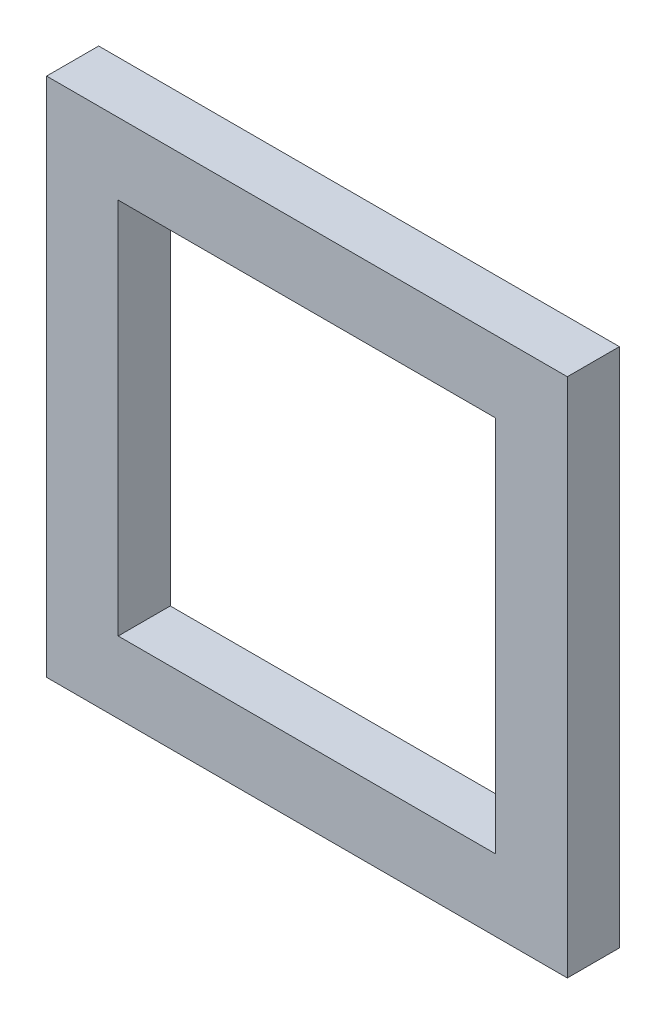
ISO-10303-21;
HEADER;
FILE_DESCRIPTION(('STEP AP214'),'2;1');
FILE_NAME('part.step','',(''),(''),'','','');
FILE_SCHEMA(('AUTOMOTIVE_DESIGN { 1 0 10303 214 1 1 1 1 }'));
ENDSEC;
DATA;
#1=APPLICATION_CONTEXT('core data for automotive mechanical design processes');
#2=APPLICATION_PROTOCOL_DEFINITION('international standard','automotive_design',2000,#1);
#3=PRODUCT_CONTEXT('',#1,'mechanical');
#4=PRODUCT('Part','Part','',(#3));
#5=PRODUCT_RELATED_PRODUCT_CATEGORY('part','',(#4));
#6=PRODUCT_DEFINITION_FORMATION('','',#4);
#7=PRODUCT_DEFINITION_CONTEXT('part definition',#1,'design');
#8=PRODUCT_DEFINITION('design','',#6,#7);
#9=PRODUCT_DEFINITION_SHAPE('','',#8);
#10=(LENGTH_UNIT() NAMED_UNIT(*) SI_UNIT(.MILLI.,.METRE.));
#11=(NAMED_UNIT(*) PLANE_ANGLE_UNIT() SI_UNIT($,.RADIAN.));
#12=(NAMED_UNIT(*) SI_UNIT($,.STERADIAN.) SOLID_ANGLE_UNIT());
#13=UNCERTAINTY_MEASURE_WITH_UNIT(LENGTH_MEASURE(1.E-05),#10,'distance_accuracy_value','');
#14=(GEOMETRIC_REPRESENTATION_CONTEXT(3) GLOBAL_UNCERTAINTY_ASSIGNED_CONTEXT((#13)) GLOBAL_UNIT_ASSIGNED_CONTEXT((#10,
#11,#12)) REPRESENTATION_CONTEXT('',''));
#15=CARTESIAN_POINT('',(0.,0.,0.));
#16=DIRECTION('',(0.,0.,1.));
#17=DIRECTION('',(1.,0.,0.));
#18=AXIS2_PLACEMENT_3D('',#15,#16,#17);
#19=CARTESIAN_POINT('',(63.5,-63.5,-12.7));
#20=DIRECTION('',(1.,0.,0.));
#21=DIRECTION('',(0.,0.,-1.));
#22=AXIS2_PLACEMENT_3D('',#19,#20,#21);
#23=PLANE('',#22);
#24=DIRECTION('',(0.,1.,0.));
#25=VECTOR('',#24,1.);
#26=CARTESIAN_POINT('',(63.5,-63.5,0.));
#27=LINE('',#26,#25);
#28=CARTESIAN_POINT('',(63.5,-63.5,0.));
#29=VERTEX_POINT('',#28);
#30=CARTESIAN_POINT('',(63.5,63.5,0.));
#31=VERTEX_POINT('',#30);
#32=EDGE_CURVE('E148',#29,#31,#27,.T.);
#33=ORIENTED_EDGE('',*,*,#32,.F.);
#34=DIRECTION('',(0.,0.,1.));
#35=VECTOR('',#34,1.);
#36=CARTESIAN_POINT('',(63.5,-63.5,-12.7));
#37=LINE('',#36,#35);
#38=CARTESIAN_POINT('',(63.5,-63.5,-12.7));
#39=VERTEX_POINT('',#38);
#40=EDGE_CURVE('E11',#39,#29,#37,.T.);
#41=ORIENTED_EDGE('',*,*,#40,.F.);
#42=DIRECTION('',(0.,1.,0.));
#43=VECTOR('',#42,1.);
#44=CARTESIAN_POINT('',(63.5,-63.5,-12.7));
#45=LINE('',#44,#43);
#46=CARTESIAN_POINT('',(63.5,63.5,-12.7));
#47=VERTEX_POINT('',#46);
#48=EDGE_CURVE('E154',#39,#47,#45,.T.);
#49=ORIENTED_EDGE('',*,*,#48,.T.);
#50=DIRECTION('',(0.,0.,1.));
#51=VECTOR('',#50,1.);
#52=CARTESIAN_POINT('',(63.5,63.5,-12.7));
#53=LINE('',#52,#51);
#54=EDGE_CURVE('E42',#47,#31,#53,.T.);
#55=ORIENTED_EDGE('',*,*,#54,.T.);
#56=EDGE_LOOP('',(#33,#41,#49,#55));
#57=FACE_BOUND('',#56,.T.);
#58=ADVANCED_FACE('F39',(#57),#23,.T.);
#59=CARTESIAN_POINT('',(-63.5,-63.5,-12.7));
#60=DIRECTION('',(0.,-1.,0.));
#61=DIRECTION('',(0.,0.,-1.));
#62=AXIS2_PLACEMENT_3D('',#59,#60,#61);
#63=PLANE('',#62);
#64=DIRECTION('',(1.,0.,0.));
#65=VECTOR('',#64,1.);
#66=CARTESIAN_POINT('',(-63.5,-63.5,0.));
#67=LINE('',#66,#65);
#68=CARTESIAN_POINT('',(-63.5,-63.5,0.));
#69=VERTEX_POINT('',#68);
#70=EDGE_CURVE('E159',#69,#29,#67,.T.);
#71=ORIENTED_EDGE('',*,*,#70,.F.);
#72=DIRECTION('',(0.,0.,1.));
#73=VECTOR('',#72,1.);
#74=CARTESIAN_POINT('',(-63.5,-63.5,-12.7));
#75=LINE('',#74,#73);
#76=CARTESIAN_POINT('',(-63.5,-63.5,-12.7));
#77=VERTEX_POINT('',#76);
#78=EDGE_CURVE('E48',#77,#69,#75,.T.);
#79=ORIENTED_EDGE('',*,*,#78,.F.);
#80=DIRECTION('',(1.,0.,0.));
#81=VECTOR('',#80,1.);
#82=CARTESIAN_POINT('',(-63.5,-63.5,-12.7));
#83=LINE('',#82,#81);
#84=EDGE_CURVE('E167',#77,#39,#83,.T.);
#85=ORIENTED_EDGE('',*,*,#84,.T.);
#86=ORIENTED_EDGE('',*,*,#40,.T.);
#87=EDGE_LOOP('',(#71,#79,#85,#86));
#88=FACE_BOUND('',#87,.T.);
#89=ADVANCED_FACE('F201',(#88),#63,.T.);
#90=CARTESIAN_POINT('',(-63.5,-63.5,-12.7));
#91=DIRECTION('',(-1.,0.,0.));
#92=DIRECTION('',(0.,0.,1.));
#93=AXIS2_PLACEMENT_3D('',#90,#91,#92);
#94=PLANE('',#93);
#95=DIRECTION('',(0.,-1.,0.));
#96=VECTOR('',#95,1.);
#97=CARTESIAN_POINT('',(-63.5,-63.5,0.));
#98=LINE('',#97,#96);
#99=CARTESIAN_POINT('',(-63.5,63.5,0.));
#100=VERTEX_POINT('',#99);
#101=EDGE_CURVE('E178',#100,#69,#98,.T.);
#102=ORIENTED_EDGE('',*,*,#101,.F.);
#103=DIRECTION('',(0.,0.,1.));
#104=VECTOR('',#103,1.);
#105=CARTESIAN_POINT('',(-63.5,63.5,-12.7));
#106=LINE('',#105,#104);
#107=CARTESIAN_POINT('',(-63.5,63.5,-12.7));
#108=VERTEX_POINT('',#107);
#109=EDGE_CURVE('E186',#108,#100,#106,.T.);
#110=ORIENTED_EDGE('',*,*,#109,.F.);
#111=DIRECTION('',(0.,-1.,0.));
#112=VECTOR('',#111,1.);
#113=CARTESIAN_POINT('',(-63.5,-63.5,-12.7));
#114=LINE('',#113,#112);
#115=EDGE_CURVE('E163',#108,#77,#114,.T.);
#116=ORIENTED_EDGE('',*,*,#115,.T.);
#117=ORIENTED_EDGE('',*,*,#78,.T.);
#118=EDGE_LOOP('',(#102,#110,#116,#117));
#119=FACE_BOUND('',#118,.T.);
#120=ADVANCED_FACE('F205',(#119),#94,.T.);
#121=CARTESIAN_POINT('',(-63.5,63.5,-12.7));
#122=DIRECTION('',(0.,1.,0.));
#123=DIRECTION('',(0.,0.,1.));
#124=AXIS2_PLACEMENT_3D('',#121,#122,#123);
#125=PLANE('',#124);
#126=DIRECTION('',(-1.,0.,0.));
#127=VECTOR('',#126,1.);
#128=CARTESIAN_POINT('',(-63.5,63.5,0.));
#129=LINE('',#128,#127);
#130=EDGE_CURVE('E174',#31,#100,#129,.T.);
#131=ORIENTED_EDGE('',*,*,#130,.F.);
#132=ORIENTED_EDGE('',*,*,#54,.F.);
#133=DIRECTION('',(-1.,0.,0.));
#134=VECTOR('',#133,1.);
#135=CARTESIAN_POINT('',(-63.5,63.5,-12.7));
#136=LINE('',#135,#134);
#137=EDGE_CURVE('E158',#47,#108,#136,.T.);
#138=ORIENTED_EDGE('',*,*,#137,.T.);
#139=ORIENTED_EDGE('',*,*,#109,.T.);
#140=EDGE_LOOP('',(#131,#132,#138,#139));
#141=FACE_BOUND('',#140,.T.);
#142=ADVANCED_FACE('F196',(#141),#125,.T.);
#143=CARTESIAN_POINT('',(0.,0.,-12.7));
#144=DIRECTION('',(0.,0.,-1.));
#145=DIRECTION('',(-1.,0.,0.));
#146=AXIS2_PLACEMENT_3D('',#143,#144,#145);
#147=PLANE('',#146);
#148=DIRECTION('',(0.,1.,0.));
#149=VECTOR('',#148,1.);
#150=CARTESIAN_POINT('',(46.0375,-46.0375,-12.7));
#151=LINE('',#150,#149);
#152=CARTESIAN_POINT('',(46.0375,-46.0375,-12.7));
#153=VERTEX_POINT('',#152);
#154=CARTESIAN_POINT('',(46.0375,46.0375,-12.7));
#155=VERTEX_POINT('',#154);
#156=EDGE_CURVE('E107',#153,#155,#151,.T.);
#157=ORIENTED_EDGE('',*,*,#156,.T.);
#158=DIRECTION('',(-1.,0.,0.));
#159=VECTOR('',#158,1.);
#160=CARTESIAN_POINT('',(-46.0375,46.0375,-12.7));
#161=LINE('',#160,#159);
#162=CARTESIAN_POINT('',(-46.0375,46.0375,-12.7));
#163=VERTEX_POINT('',#162);
#164=EDGE_CURVE('E117',#155,#163,#161,.T.);
#165=ORIENTED_EDGE('',*,*,#164,.T.);
#166=DIRECTION('',(0.,-1.,0.));
#167=VECTOR('',#166,1.);
#168=CARTESIAN_POINT('',(-46.0375,-46.0375,-12.7));
#169=LINE('',#168,#167);
#170=CARTESIAN_POINT('',(-46.0375,-46.0375,-12.7));
#171=VERTEX_POINT('',#170);
#172=EDGE_CURVE('E56',#163,#171,#169,.T.);
#173=ORIENTED_EDGE('',*,*,#172,.T.);
#174=DIRECTION('',(1.,0.,0.));
#175=VECTOR('',#174,1.);
#176=CARTESIAN_POINT('',(-46.0375,-46.0375,-12.7));
#177=LINE('',#176,#175);
#178=EDGE_CURVE('E114',#171,#153,#177,.T.);
#179=ORIENTED_EDGE('',*,*,#178,.T.);
#180=EDGE_LOOP('',(#157,#165,#173,#179));
#181=FACE_BOUND('',#180,.T.);
#182=ORIENTED_EDGE('',*,*,#48,.F.);
#183=ORIENTED_EDGE('',*,*,#84,.F.);
#184=ORIENTED_EDGE('',*,*,#115,.F.);
#185=ORIENTED_EDGE('',*,*,#137,.F.);
#186=EDGE_LOOP('',(#182,#183,#184,#185));
#187=FACE_BOUND('',#186,.T.);
#188=ADVANCED_FACE('F122',(#181,#187),#147,.T.);
#189=CARTESIAN_POINT('',(0.,0.,0.));
#190=DIRECTION('',(0.,0.,-1.));
#191=DIRECTION('',(-1.,0.,0.));
#192=AXIS2_PLACEMENT_3D('',#189,#190,#191);
#193=PLANE('',#192);
#194=DIRECTION('',(-1.,0.,0.));
#195=VECTOR('',#194,1.);
#196=CARTESIAN_POINT('',(-46.0375,46.0375,0.));
#197=LINE('',#196,#195);
#198=CARTESIAN_POINT('',(46.0375,46.0375,0.));
#199=VERTEX_POINT('',#198);
#200=CARTESIAN_POINT('',(-46.0375,46.0375,0.));
#201=VERTEX_POINT('',#200);
#202=EDGE_CURVE('E139',#199,#201,#197,.T.);
#203=ORIENTED_EDGE('',*,*,#202,.F.);
#204=DIRECTION('',(0.,1.,0.));
#205=VECTOR('',#204,1.);
#206=CARTESIAN_POINT('',(46.0375,-46.0375,0.));
#207=LINE('',#206,#205);
#208=CARTESIAN_POINT('',(46.0375,-46.0375,0.));
#209=VERTEX_POINT('',#208);
#210=EDGE_CURVE('E64',#209,#199,#207,.T.);
#211=ORIENTED_EDGE('',*,*,#210,.F.);
#212=DIRECTION('',(1.,0.,0.));
#213=VECTOR('',#212,1.);
#214=CARTESIAN_POINT('',(-46.0375,-46.0375,0.));
#215=LINE('',#214,#213);
#216=CARTESIAN_POINT('',(-46.0375,-46.0375,0.));
#217=VERTEX_POINT('',#216);
#218=EDGE_CURVE('E126',#217,#209,#215,.T.);
#219=ORIENTED_EDGE('',*,*,#218,.F.);
#220=DIRECTION('',(0.,-1.,0.));
#221=VECTOR('',#220,1.);
#222=CARTESIAN_POINT('',(-46.0375,-46.0375,0.));
#223=LINE('',#222,#221);
#224=EDGE_CURVE('E130',#201,#217,#223,.T.);
#225=ORIENTED_EDGE('',*,*,#224,.F.);
#226=EDGE_LOOP('',(#203,#211,#219,#225));
#227=FACE_BOUND('',#226,.T.);
#228=ORIENTED_EDGE('',*,*,#32,.T.);
#229=ORIENTED_EDGE('',*,*,#130,.T.);
#230=ORIENTED_EDGE('',*,*,#101,.T.);
#231=ORIENTED_EDGE('',*,*,#70,.T.);
#232=EDGE_LOOP('',(#228,#229,#230,#231));
#233=FACE_BOUND('',#232,.T.);
#234=ADVANCED_FACE('F198',(#227,#233),#193,.F.);
#235=CARTESIAN_POINT('',(46.0375,-46.0375,-12.7));
#236=DIRECTION('',(1.,0.,0.));
#237=DIRECTION('',(0.,0.,-1.));
#238=AXIS2_PLACEMENT_3D('',#235,#236,#237);
#239=PLANE('',#238);
#240=ORIENTED_EDGE('',*,*,#210,.T.);
#241=DIRECTION('',(0.,0.,1.));
#242=VECTOR('',#241,1.);
#243=CARTESIAN_POINT('',(46.0375,46.0375,-12.7));
#244=LINE('',#243,#242);
#245=EDGE_CURVE('E103',#155,#199,#244,.T.);
#246=ORIENTED_EDGE('',*,*,#245,.F.);
#247=ORIENTED_EDGE('',*,*,#156,.F.);
#248=DIRECTION('',(0.,0.,1.));
#249=VECTOR('',#248,1.);
#250=CARTESIAN_POINT('',(46.0375,-46.0375,-12.7));
#251=LINE('',#250,#249);
#252=EDGE_CURVE('E145',#153,#209,#251,.T.);
#253=ORIENTED_EDGE('',*,*,#252,.T.);
#254=EDGE_LOOP('',(#240,#246,#247,#253));
#255=FACE_BOUND('',#254,.T.);
#256=ADVANCED_FACE('F105',(#255),#239,.F.);
#257=CARTESIAN_POINT('',(-46.0375,-46.0375,-12.7));
#258=DIRECTION('',(0.,-1.,0.));
#259=DIRECTION('',(0.,0.,-1.));
#260=AXIS2_PLACEMENT_3D('',#257,#258,#259);
#261=PLANE('',#260);
#262=ORIENTED_EDGE('',*,*,#218,.T.);
#263=ORIENTED_EDGE('',*,*,#252,.F.);
#264=ORIENTED_EDGE('',*,*,#178,.F.);
#265=DIRECTION('',(0.,0.,1.));
#266=VECTOR('',#265,1.);
#267=CARTESIAN_POINT('',(-46.0375,-46.0375,-12.7));
#268=LINE('',#267,#266);
#269=EDGE_CURVE('E149',#171,#217,#268,.T.);
#270=ORIENTED_EDGE('',*,*,#269,.T.);
#271=EDGE_LOOP('',(#262,#263,#264,#270));
#272=FACE_BOUND('',#271,.T.);
#273=ADVANCED_FACE('F256',(#272),#261,.F.);
#274=CARTESIAN_POINT('',(-46.0375,-46.0375,-12.7));
#275=DIRECTION('',(-1.,0.,0.));
#276=DIRECTION('',(0.,0.,1.));
#277=AXIS2_PLACEMENT_3D('',#274,#275,#276);
#278=PLANE('',#277);
#279=ORIENTED_EDGE('',*,*,#224,.T.);
#280=ORIENTED_EDGE('',*,*,#269,.F.);
#281=ORIENTED_EDGE('',*,*,#172,.F.);
#282=DIRECTION('',(0.,0.,1.));
#283=VECTOR('',#282,1.);
#284=CARTESIAN_POINT('',(-46.0375,46.0375,-12.7));
#285=LINE('',#284,#283);
#286=EDGE_CURVE('E113',#163,#201,#285,.T.);
#287=ORIENTED_EDGE('',*,*,#286,.T.);
#288=EDGE_LOOP('',(#279,#280,#281,#287));
#289=FACE_BOUND('',#288,.T.);
#290=ADVANCED_FACE('F265',(#289),#278,.F.);
#291=CARTESIAN_POINT('',(-46.0375,46.0375,-12.7));
#292=DIRECTION('',(0.,1.,0.));
#293=DIRECTION('',(0.,0.,1.));
#294=AXIS2_PLACEMENT_3D('',#291,#292,#293);
#295=PLANE('',#294);
#296=ORIENTED_EDGE('',*,*,#202,.T.);
#297=ORIENTED_EDGE('',*,*,#286,.F.);
#298=ORIENTED_EDGE('',*,*,#164,.F.);
#299=ORIENTED_EDGE('',*,*,#245,.T.);
#300=EDGE_LOOP('',(#296,#297,#298,#299));
#301=FACE_BOUND('',#300,.T.);
#302=ADVANCED_FACE('F118',(#301),#295,.F.);
#303=CLOSED_SHELL('',(#58,#89,#120,#142,#188,#234,#256,#273,#290,#302));
#304=MANIFOLD_SOLID_BREP('B2',#303);
#305=ADVANCED_BREP_SHAPE_REPRESENTATION('',(#18,#304),#14);
#306=SHAPE_DEFINITION_REPRESENTATION(#9,#305);
ENDSEC;
END-ISO-10303-21;
